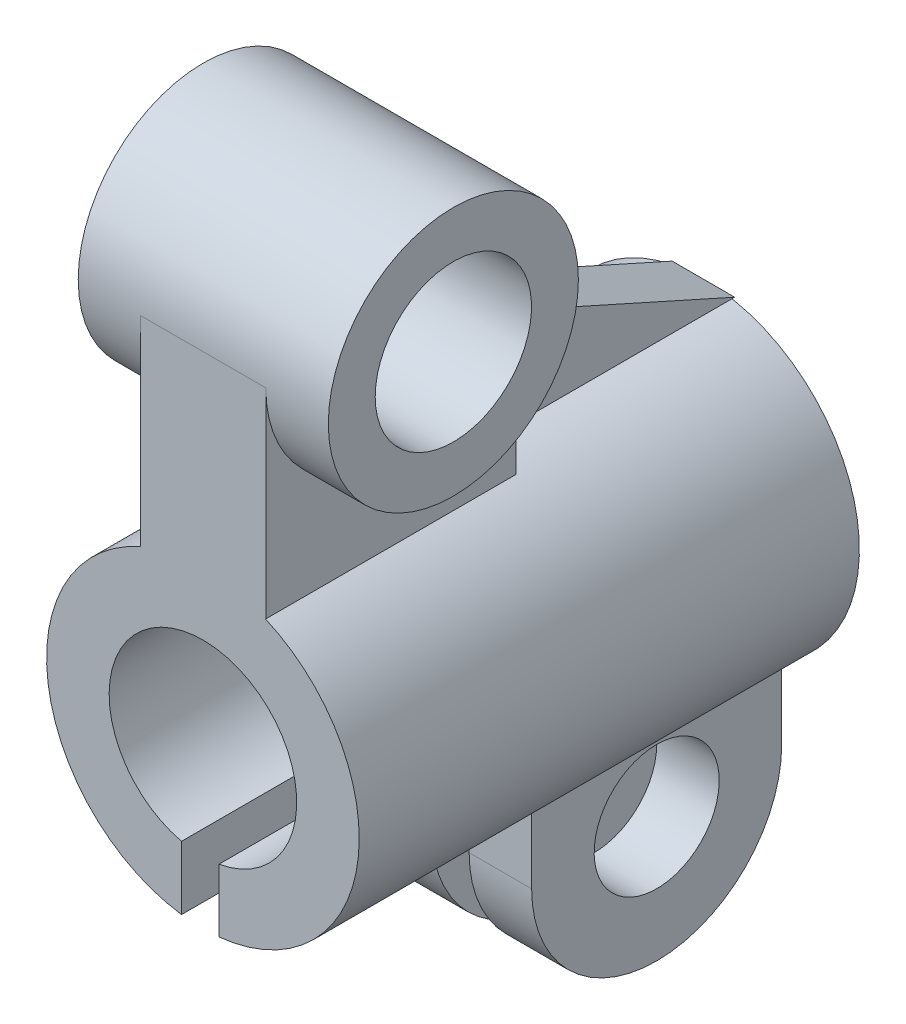
ISO-10303-21;
HEADER;
FILE_DESCRIPTION(('STEP AP214'),'2;1');
FILE_NAME('part.step','',(''),(''),'','','');
FILE_SCHEMA(('AUTOMOTIVE_DESIGN { 1 0 10303 214 1 1 1 1 }'));
ENDSEC;
DATA;
#1=APPLICATION_CONTEXT('core data for automotive mechanical design processes');
#2=APPLICATION_PROTOCOL_DEFINITION('international standard','automotive_design',2000,#1);
#3=PRODUCT_CONTEXT('',#1,'mechanical');
#4=PRODUCT('Part','Part','',(#3));
#5=PRODUCT_RELATED_PRODUCT_CATEGORY('part','',(#4));
#6=PRODUCT_DEFINITION_FORMATION('','',#4);
#7=PRODUCT_DEFINITION_CONTEXT('part definition',#1,'design');
#8=PRODUCT_DEFINITION('design','',#6,#7);
#9=PRODUCT_DEFINITION_SHAPE('','',#8);
#10=(LENGTH_UNIT() NAMED_UNIT(*) SI_UNIT(.MILLI.,.METRE.));
#11=(NAMED_UNIT(*) PLANE_ANGLE_UNIT() SI_UNIT($,.RADIAN.));
#12=(NAMED_UNIT(*) SI_UNIT($,.STERADIAN.) SOLID_ANGLE_UNIT());
#13=UNCERTAINTY_MEASURE_WITH_UNIT(LENGTH_MEASURE(1.E-05),#10,'distance_accuracy_value','');
#14=(GEOMETRIC_REPRESENTATION_CONTEXT(3) GLOBAL_UNCERTAINTY_ASSIGNED_CONTEXT((#13)) GLOBAL_UNIT_ASSIGNED_CONTEXT((#10,
#11,#12)) REPRESENTATION_CONTEXT('',''));
#15=CARTESIAN_POINT('',(0.,0.,0.));
#16=DIRECTION('',(0.,0.,1.));
#17=DIRECTION('',(1.,0.,0.));
#18=AXIS2_PLACEMENT_3D('',#15,#16,#17);
#19=CARTESIAN_POINT('',(-27.7278499890445,20.6508963836453,80.));
#20=DIRECTION('',(0.,0.,-1.));
#21=DIRECTION('',(-1.,0.,0.));
#22=AXIS2_PLACEMENT_3D('',#19,#20,#21);
#23=CYLINDRICAL_SURFACE('',#22,25.);
#24=CARTESIAN_POINT('',(-27.7278499890445,20.6508963836453,88261.9752119037));
#25=DIRECTION('',(0.,0.999999959885377,0.000283247671912091));
#26=DIRECTION('',(0.,0.000283247671912091,-0.999999959885377));
#27=AXIS2_PLACEMENT_3D('',#24,#25,#26);
#28=ELLIPSE('',#27,88261.9787524997,25.);
#29=CARTESIAN_POINT('',(-27.7278499890445,45.6508963836453,0.));
#30=VERTEX_POINT('',#29);
#31=CARTESIAN_POINT('',(-28.4804235733198,45.6395664763143,40.));
#32=VERTEX_POINT('',#31);
#33=EDGE_CURVE('E216',#30,#32,#28,.T.);
#34=ORIENTED_EDGE('',*,*,#33,.F.);
#35=CARTESIAN_POINT('',(-27.7278499890445,20.6508963836453,0.));
#36=DIRECTION('',(0.,0.,1.));
#37=DIRECTION('',(1.,0.,0.));
#38=AXIS2_PLACEMENT_3D('',#35,#36,#37);
#39=CIRCLE('',#38,25.);
#40=CARTESIAN_POINT('',(-41.0015400751516,-0.534219889294647,0.));
#41=VERTEX_POINT('',#40);
#42=EDGE_CURVE('E279',#30,#41,#39,.T.);
#43=ORIENTED_EDGE('',*,*,#42,.T.);
#44=DIRECTION('',(0.,0.,-1.));
#45=VECTOR('',#44,1.);
#46=CARTESIAN_POINT('',(-41.0015400751516,-0.534219889294654,80.));
#47=LINE('',#46,#45);
#48=CARTESIAN_POINT('',(-41.0015400751516,-0.534219889294647,40.));
#49=VERTEX_POINT('',#48);
#50=EDGE_CURVE('E293',#49,#41,#47,.T.);
#51=ORIENTED_EDGE('',*,*,#50,.F.);
#52=CARTESIAN_POINT('',(-27.7278499890445,20.6508963836453,40.));
#53=DIRECTION('',(0.,0.,1.));
#54=DIRECTION('',(1.,0.,0.));
#55=AXIS2_PLACEMENT_3D('',#52,#53,#54);
#56=CIRCLE('',#55,25.);
#57=CARTESIAN_POINT('',(-31.149550202957,-4.11383595179724,40.));
#58=VERTEX_POINT('',#57);
#59=EDGE_CURVE('E290',#49,#58,#56,.T.);
#60=ORIENTED_EDGE('',*,*,#59,.T.);
#61=DIRECTION('',(0.,0.,-1.));
#62=VECTOR('',#61,1.);
#63=CARTESIAN_POINT('',(-31.149550202957,-4.11383595179724,80.));
#64=LINE('',#63,#62);
#65=CARTESIAN_POINT('',(-31.149550202957,-4.11383595179724,80.));
#66=VERTEX_POINT('',#65);
#67=EDGE_CURVE('E240',#58,#66,#64,.F.);
#68=ORIENTED_EDGE('',*,*,#67,.T.);
#69=CARTESIAN_POINT('',(-27.7278499890445,20.6508963836453,80.));
#70=DIRECTION('',(0.,0.,1.));
#71=DIRECTION('',(1.,0.,0.));
#72=AXIS2_PLACEMENT_3D('',#69,#70,#71);
#73=CIRCLE('',#72,25.);
#74=CARTESIAN_POINT('',(-37.6730946822229,43.5875942277728,80.));
#75=VERTEX_POINT('',#74);
#76=EDGE_CURVE('E286',#75,#66,#73,.T.);
#77=ORIENTED_EDGE('',*,*,#76,.F.);
#78=DIRECTION('',(0.,0.,1.));
#79=VECTOR('',#78,1.);
#80=CARTESIAN_POINT('',(-37.6730946822229,43.5875942277728,40.));
#81=LINE('',#80,#79);
#82=CARTESIAN_POINT('',(-37.6730946822229,43.5875942277728,40.));
#83=VERTEX_POINT('',#82);
#84=EDGE_CURVE('E209',#83,#75,#81,.T.);
#85=ORIENTED_EDGE('',*,*,#84,.F.);
#86=CARTESIAN_POINT('',(-27.7278499890445,20.6508963836453,40.));
#87=DIRECTION('',(0.,0.,-1.));
#88=DIRECTION('',(-1.,0.,0.));
#89=AXIS2_PLACEMENT_3D('',#86,#87,#88);
#90=CIRCLE('',#89,25.);
#91=EDGE_CURVE('E319',#83,#32,#90,.T.);
#92=ORIENTED_EDGE('',*,*,#91,.T.);
#93=EDGE_LOOP('',(#34,#43,#51,#60,#68,#77,#85,#92));
#94=FACE_BOUND('',#93,.T.);
#95=ADVANCED_FACE('F43',(#94),#23,.T.);
#96=CARTESIAN_POINT('',(-26.9752764047693,45.6395664763143,40.));
#97=VERTEX_POINT('',#96);
#98=EDGE_CURVE('E333',#97,#30,#28,.T.);
#99=ORIENTED_EDGE('',*,*,#98,.F.);
#100=CARTESIAN_POINT('',(-17.7826052958661,43.5875942277728,40.));
#101=VERTEX_POINT('',#100);
#102=EDGE_CURVE('E316',#97,#101,#90,.T.);
#103=ORIENTED_EDGE('',*,*,#102,.T.);
#104=DIRECTION('',(0.,0.,-1.));
#105=VECTOR('',#104,1.);
#106=CARTESIAN_POINT('',(-17.7826052958661,43.5875942277728,80.));
#107=LINE('',#106,#105);
#108=CARTESIAN_POINT('',(-17.7826052958661,43.5875942277728,80.));
#109=VERTEX_POINT('',#108);
#110=EDGE_CURVE('E322',#101,#109,#107,.F.);
#111=ORIENTED_EDGE('',*,*,#110,.T.);
#112=CARTESIAN_POINT('',(-25.149550202957,-4.21579560007185,80.));
#113=VERTEX_POINT('',#112);
#114=EDGE_CURVE('E282',#113,#109,#73,.T.);
#115=ORIENTED_EDGE('',*,*,#114,.F.);
#116=DIRECTION('',(0.,0.,-1.));
#117=VECTOR('',#116,1.);
#118=CARTESIAN_POINT('',(-25.149550202957,-4.21579560007185,80.));
#119=LINE('',#118,#117);
#120=CARTESIAN_POINT('',(-25.149550202957,-4.21579560007185,40.));
#121=VERTEX_POINT('',#120);
#122=EDGE_CURVE('E249',#113,#121,#119,.T.);
#123=ORIENTED_EDGE('',*,*,#122,.T.);
#124=CARTESIAN_POINT('',(-15.149550202957,-0.95434313114166,40.));
#125=VERTEX_POINT('',#124);
#126=EDGE_CURVE('E285',#121,#125,#56,.T.);
#127=ORIENTED_EDGE('',*,*,#126,.T.);
#128=DIRECTION('',(0.,0.,-1.));
#129=VECTOR('',#128,1.);
#130=CARTESIAN_POINT('',(-15.149550202957,-0.95434313114166,80.));
#131=LINE('',#130,#129);
#132=CARTESIAN_POINT('',(-15.149550202957,-0.95434313114166,0.));
#133=VERTEX_POINT('',#132);
#134=EDGE_CURVE('E296',#125,#133,#131,.T.);
#135=ORIENTED_EDGE('',*,*,#134,.T.);
#136=EDGE_CURVE('E287',#133,#30,#39,.T.);
#137=ORIENTED_EDGE('',*,*,#136,.T.);
#138=EDGE_LOOP('',(#99,#103,#111,#115,#123,#127,#135,#137));
#139=FACE_BOUND('',#138,.T.);
#140=ADVANCED_FACE('F337',(#139),#23,.T.);
#141=CARTESIAN_POINT('',(0.,0.,40.));
#142=DIRECTION('',(0.,0.,-1.));
#143=DIRECTION('',(-1.,0.,0.));
#144=AXIS2_PLACEMENT_3D('',#141,#142,#143);
#145=PLANE('',#144);
#146=DIRECTION('',(0.,1.,0.));
#147=VECTOR('',#146,1.);
#148=CARTESIAN_POINT('',(-32.6730946822229,63.5875942277729,40.));
#149=LINE('',#148,#147);
#150=CARTESIAN_POINT('',(-32.6730946822229,45.6395664763143,40.));
#151=VERTEX_POINT('',#150);
#152=CARTESIAN_POINT('',(-32.6730946822229,63.5875942277729,40.));
#153=VERTEX_POINT('',#152);
#154=EDGE_CURVE('E503',#151,#153,#149,.T.);
#155=ORIENTED_EDGE('',*,*,#154,.F.);
#156=DIRECTION('',(1.,0.,0.));
#157=VECTOR('',#156,1.);
#158=CARTESIAN_POINT('',(-32.6730946822229,45.6395664763143,40.));
#159=LINE('',#158,#157);
#160=EDGE_CURVE('E339',#151,#32,#159,.T.);
#161=ORIENTED_EDGE('',*,*,#160,.T.);
#162=ORIENTED_EDGE('',*,*,#91,.F.);
#163=DIRECTION('',(0.,-1.,0.));
#164=VECTOR('',#163,1.);
#165=CARTESIAN_POINT('',(-37.6730946822229,43.5875942277728,40.));
#166=LINE('',#165,#164);
#167=CARTESIAN_POINT('',(-37.6730946822229,75.5875942277729,40.));
#168=VERTEX_POINT('',#167);
#169=EDGE_CURVE('E208',#168,#83,#166,.T.);
#170=ORIENTED_EDGE('',*,*,#169,.F.);
#171=DIRECTION('',(-1.,0.,0.));
#172=VECTOR('',#171,1.);
#173=CARTESIAN_POINT('',(-37.6730946822229,75.5875942277729,40.));
#174=LINE('',#173,#172);
#175=CARTESIAN_POINT('',(-17.6730946822229,75.5875942277729,40.));
#176=VERTEX_POINT('',#175);
#177=EDGE_CURVE('E188',#176,#168,#174,.T.);
#178=ORIENTED_EDGE('',*,*,#177,.F.);
#179=DIRECTION('',(0.,1.,0.));
#180=VECTOR('',#179,1.);
#181=CARTESIAN_POINT('',(-17.6730946822229,43.5875942277728,40.));
#182=LINE('',#181,#180);
#183=CARTESIAN_POINT('',(-17.6730946822229,43.5875942277728,40.));
#184=VERTEX_POINT('',#183);
#185=EDGE_CURVE('E196',#184,#176,#182,.T.);
#186=ORIENTED_EDGE('',*,*,#185,.F.);
#187=DIRECTION('',(1.,0.,0.));
#188=VECTOR('',#187,1.);
#189=CARTESIAN_POINT('',(-37.6730946822229,43.5875942277728,40.));
#190=LINE('',#189,#188);
#191=EDGE_CURVE('E202',#101,#184,#190,.T.);
#192=ORIENTED_EDGE('',*,*,#191,.F.);
#193=ORIENTED_EDGE('',*,*,#102,.F.);
#194=DIRECTION('',(1.,0.,0.));
#195=VECTOR('',#194,1.);
#196=CARTESIAN_POINT('',(0.,45.6395664763143,40.));
#197=LINE('',#196,#195);
#198=CARTESIAN_POINT('',(-22.6730946822229,45.6395664763143,40.));
#199=VERTEX_POINT('',#198);
#200=EDGE_CURVE('E52',#97,#199,#197,.T.);
#201=ORIENTED_EDGE('',*,*,#200,.T.);
#202=DIRECTION('',(0.,1.,0.));
#203=VECTOR('',#202,1.);
#204=CARTESIAN_POINT('',(-22.6730946822229,63.5875942277729,40.));
#205=LINE('',#204,#203);
#206=CARTESIAN_POINT('',(-22.6730946822229,63.5875942277729,40.));
#207=VERTEX_POINT('',#206);
#208=EDGE_CURVE('E328',#199,#207,#205,.T.);
#209=ORIENTED_EDGE('',*,*,#208,.T.);
#210=DIRECTION('',(1.,0.,0.));
#211=VECTOR('',#210,1.);
#212=CARTESIAN_POINT('',(-32.6730946822229,63.5875942277729,40.));
#213=LINE('',#212,#211);
#214=EDGE_CURVE('E342',#153,#207,#213,.T.);
#215=ORIENTED_EDGE('',*,*,#214,.F.);
#216=EDGE_LOOP('',(#155,#161,#162,#170,#178,#186,#192,#193,#201,#209,#215));
#217=FACE_BOUND('',#216,.T.);
#218=ADVANCED_FACE('F206',(#217),#145,.T.);
#219=CARTESIAN_POINT('',(-15.149550202957,-12.5342198892947,20.));
#220=DIRECTION('',(-1.,0.,0.));
#221=DIRECTION('',(0.,0.,1.));
#222=AXIS2_PLACEMENT_3D('',#219,#220,#221);
#223=CYLINDRICAL_SURFACE('',#222,20.);
#224=CARTESIAN_POINT('',(-25.149550202957,-12.5342198892947,20.));
#225=DIRECTION('',(1.,0.,0.));
#226=DIRECTION('',(0.,0.,-1.));
#227=AXIS2_PLACEMENT_3D('',#224,#225,#226);
#228=CIRCLE('',#227,20.);
#229=CARTESIAN_POINT('',(-25.149550202957,-12.5342198892947,0.));
#230=VERTEX_POINT('',#229);
#231=CARTESIAN_POINT('',(-25.149550202957,-12.5342198892947,40.));
#232=VERTEX_POINT('',#231);
#233=EDGE_CURVE('E252',#230,#232,#228,.F.);
#234=ORIENTED_EDGE('',*,*,#233,.F.);
#235=DIRECTION('',(1.,0.,0.));
#236=VECTOR('',#235,1.);
#237=CARTESIAN_POINT('',(-15.149550202957,-12.5342198892947,0.));
#238=LINE('',#237,#236);
#239=CARTESIAN_POINT('',(-15.149550202957,-12.5342198892947,0.));
#240=VERTEX_POINT('',#239);
#241=EDGE_CURVE('E300',#240,#230,#238,.F.);
#242=ORIENTED_EDGE('',*,*,#241,.F.);
#243=CARTESIAN_POINT('',(-15.149550202957,-12.5342198892947,20.));
#244=DIRECTION('',(1.,0.,0.));
#245=DIRECTION('',(0.,1.,0.));
#246=AXIS2_PLACEMENT_3D('',#243,#244,#245);
#247=CIRCLE('',#246,20.);
#248=CARTESIAN_POINT('',(-15.149550202957,-12.5342198892947,40.));
#249=VERTEX_POINT('',#248);
#250=EDGE_CURVE('E307',#249,#240,#247,.T.);
#251=ORIENTED_EDGE('',*,*,#250,.F.);
#252=DIRECTION('',(-1.,0.,0.));
#253=VECTOR('',#252,1.);
#254=CARTESIAN_POINT('',(0.,-12.5342198892947,40.));
#255=LINE('',#254,#253);
#256=EDGE_CURVE('E303',#232,#249,#255,.F.);
#257=ORIENTED_EDGE('',*,*,#256,.F.);
#258=EDGE_LOOP('',(#234,#242,#251,#257));
#259=FACE_BOUND('',#258,.T.);
#260=ADVANCED_FACE('F368',(#259),#223,.T.);
#261=CARTESIAN_POINT('',(0.,0.,40.));
#262=DIRECTION('',(0.,0.,1.));
#263=DIRECTION('',(1.,0.,0.));
#264=AXIS2_PLACEMENT_3D('',#261,#262,#263);
#265=PLANE('',#264);
#266=DIRECTION('',(0.,1.,0.));
#267=VECTOR('',#266,1.);
#268=CARTESIAN_POINT('',(-25.149550202957,0.,40.));
#269=LINE('',#268,#267);
#270=EDGE_CURVE('E314',#232,#121,#269,.T.);
#271=ORIENTED_EDGE('',*,*,#270,.F.);
#272=ORIENTED_EDGE('',*,*,#256,.T.);
#273=DIRECTION('',(0.,-1.,0.));
#274=VECTOR('',#273,1.);
#275=CARTESIAN_POINT('',(-15.149550202957,-0.534219889294654,40.));
#276=LINE('',#275,#274);
#277=EDGE_CURVE('E263',#125,#249,#276,.T.);
#278=ORIENTED_EDGE('',*,*,#277,.F.);
#279=ORIENTED_EDGE('',*,*,#126,.F.);
#280=EDGE_LOOP('',(#271,#272,#278,#279));
#281=FACE_BOUND('',#280,.T.);
#282=ADVANCED_FACE('F372',(#281),#265,.T.);
#283=CARTESIAN_POINT('',(-31.149550202957,-12.5342198892947,20.));
#284=DIRECTION('',(-1.,0.,0.));
#285=DIRECTION('',(0.,0.,1.));
#286=AXIS2_PLACEMENT_3D('',#283,#284,#285);
#287=CIRCLE('',#286,20.);
#288=CARTESIAN_POINT('',(-31.149550202957,-12.5342198892947,40.));
#289=VERTEX_POINT('',#288);
#290=CARTESIAN_POINT('',(-31.149550202957,-12.5342198892947,0.));
#291=VERTEX_POINT('',#290);
#292=EDGE_CURVE('E245',#289,#291,#287,.F.);
#293=ORIENTED_EDGE('',*,*,#292,.F.);
#294=CARTESIAN_POINT('',(-41.149550202957,-12.5342198892947,40.));
#295=VERTEX_POINT('',#294);
#296=EDGE_CURVE('E304',#295,#289,#255,.F.);
#297=ORIENTED_EDGE('',*,*,#296,.F.);
#298=CARTESIAN_POINT('',(-41.149550202957,-12.5342198892947,20.));
#299=DIRECTION('',(1.,0.,0.));
#300=DIRECTION('',(0.,0.,-1.));
#301=AXIS2_PLACEMENT_3D('',#298,#299,#300);
#302=CIRCLE('',#301,20.);
#303=CARTESIAN_POINT('',(-41.149550202957,-12.5342198892947,0.));
#304=VERTEX_POINT('',#303);
#305=EDGE_CURVE('E309',#304,#295,#302,.F.);
#306=ORIENTED_EDGE('',*,*,#305,.F.);
#307=EDGE_CURVE('E299',#291,#304,#238,.F.);
#308=ORIENTED_EDGE('',*,*,#307,.F.);
#309=EDGE_LOOP('',(#293,#297,#306,#308));
#310=FACE_BOUND('',#309,.T.);
#311=ADVANCED_FACE('F46',(#310),#223,.T.);
#312=CARTESIAN_POINT('',(-27.7278499890445,20.6508963836453,80.));
#313=DIRECTION('',(0.,0.,1.));
#314=DIRECTION('',(1.,0.,0.));
#315=AXIS2_PLACEMENT_3D('',#312,#313,#314);
#316=PLANE('',#315);
#317=ORIENTED_EDGE('',*,*,#114,.T.);
#318=DIRECTION('',(1.,0.,0.));
#319=VECTOR('',#318,1.);
#320=CARTESIAN_POINT('',(-37.6730946822229,43.5875942277728,80.));
#321=LINE('',#320,#319);
#322=CARTESIAN_POINT('',(-17.6730946822229,43.5875942277728,80.));
#323=VERTEX_POINT('',#322);
#324=EDGE_CURVE('E215',#109,#323,#321,.T.);
#325=ORIENTED_EDGE('',*,*,#324,.T.);
#326=DIRECTION('',(0.,1.,0.));
#327=VECTOR('',#326,1.);
#328=CARTESIAN_POINT('',(-17.6730946822229,43.5875942277728,80.));
#329=LINE('',#328,#327);
#330=CARTESIAN_POINT('',(-17.6730946822229,75.5875942277729,80.));
#331=VERTEX_POINT('',#330);
#332=EDGE_CURVE('E218',#323,#331,#329,.T.);
#333=ORIENTED_EDGE('',*,*,#332,.T.);
#334=DIRECTION('',(-1.,0.,0.));
#335=VECTOR('',#334,1.);
#336=CARTESIAN_POINT('',(-37.6730946822229,75.5875942277729,80.));
#337=LINE('',#336,#335);
#338=CARTESIAN_POINT('',(-37.6730946822229,75.5875942277729,80.));
#339=VERTEX_POINT('',#338);
#340=EDGE_CURVE('E190',#331,#339,#337,.T.);
#341=ORIENTED_EDGE('',*,*,#340,.T.);
#342=DIRECTION('',(0.,-1.,0.));
#343=VECTOR('',#342,1.);
#344=CARTESIAN_POINT('',(-37.6730946822229,43.5875942277728,80.));
#345=LINE('',#344,#343);
#346=EDGE_CURVE('E67',#339,#75,#345,.T.);
#347=ORIENTED_EDGE('',*,*,#346,.T.);
#348=ORIENTED_EDGE('',*,*,#76,.T.);
#349=DIRECTION('',(0.,1.,0.));
#350=VECTOR('',#349,1.);
#351=CARTESIAN_POINT('',(-31.149550202957,-32.5342198892947,80.));
#352=LINE('',#351,#350);
#353=CARTESIAN_POINT('',(-31.149550202957,6.04637764299135,80.));
#354=VERTEX_POINT('',#353);
#355=EDGE_CURVE('E236',#66,#354,#352,.T.);
#356=ORIENTED_EDGE('',*,*,#355,.T.);
#357=CARTESIAN_POINT('',(-27.7278499890445,20.6508963836453,80.));
#358=DIRECTION('',(0.,0.,1.));
#359=DIRECTION('',(1.,0.,0.));
#360=AXIS2_PLACEMENT_3D('',#357,#358,#359);
#361=CIRCLE('',#360,15.);
#362=CARTESIAN_POINT('',(-25.149550202957,5.87414538036105,80.));
#363=VERTEX_POINT('',#362);
#364=EDGE_CURVE('E276',#363,#354,#361,.T.);
#365=ORIENTED_EDGE('',*,*,#364,.F.);
#366=DIRECTION('',(0.,-1.,0.));
#367=VECTOR('',#366,1.);
#368=CARTESIAN_POINT('',(-25.149550202957,-32.5342198892947,80.));
#369=LINE('',#368,#367);
#370=EDGE_CURVE('E233',#363,#113,#369,.T.);
#371=ORIENTED_EDGE('',*,*,#370,.T.);
#372=EDGE_LOOP('',(#317,#325,#333,#341,#347,#348,#356,#365,#371));
#373=FACE_BOUND('',#372,.T.);
#374=ADVANCED_FACE('F349',(#373),#316,.T.);
#375=CARTESIAN_POINT('',(-27.7278499890445,20.6508963836453,0.));
#376=DIRECTION('',(0.,0.,1.));
#377=DIRECTION('',(1.,0.,0.));
#378=AXIS2_PLACEMENT_3D('',#375,#376,#377);
#379=PLANE('',#378);
#380=ORIENTED_EDGE('',*,*,#241,.T.);
#381=DIRECTION('',(0.,-1.,0.));
#382=VECTOR('',#381,1.);
#383=CARTESIAN_POINT('',(-25.149550202957,-32.5342198892947,0.));
#384=LINE('',#383,#382);
#385=CARTESIAN_POINT('',(-25.149550202957,5.87414538036105,0.));
#386=VERTEX_POINT('',#385);
#387=EDGE_CURVE('E232',#386,#230,#384,.T.);
#388=ORIENTED_EDGE('',*,*,#387,.F.);
#389=CARTESIAN_POINT('',(-27.7278499890445,20.6508963836453,0.));
#390=DIRECTION('',(0.,0.,1.));
#391=DIRECTION('',(1.,0.,0.));
#392=AXIS2_PLACEMENT_3D('',#389,#390,#391);
#393=CIRCLE('',#392,15.);
#394=CARTESIAN_POINT('',(-31.149550202957,6.04637764299135,0.));
#395=VERTEX_POINT('',#394);
#396=EDGE_CURVE('E275',#386,#395,#393,.T.);
#397=ORIENTED_EDGE('',*,*,#396,.T.);
#398=DIRECTION('',(0.,1.,0.));
#399=VECTOR('',#398,1.);
#400=CARTESIAN_POINT('',(-31.149550202957,-32.5342198892947,0.));
#401=LINE('',#400,#399);
#402=EDGE_CURVE('E237',#291,#395,#401,.T.);
#403=ORIENTED_EDGE('',*,*,#402,.F.);
#404=ORIENTED_EDGE('',*,*,#307,.T.);
#405=DIRECTION('',(0.,-1.,0.));
#406=VECTOR('',#405,1.);
#407=CARTESIAN_POINT('',(-41.149550202957,-0.534219889294654,0.));
#408=LINE('',#407,#406);
#409=CARTESIAN_POINT('',(-41.149550202957,-0.534219889294654,0.));
#410=VERTEX_POINT('',#409);
#411=EDGE_CURVE('E256',#410,#304,#408,.T.);
#412=ORIENTED_EDGE('',*,*,#411,.F.);
#413=DIRECTION('',(-1.,0.,0.));
#414=VECTOR('',#413,1.);
#415=CARTESIAN_POINT('',(-15.149550202957,-0.534219889294654,0.));
#416=LINE('',#415,#414);
#417=EDGE_CURVE('E269',#41,#410,#416,.T.);
#418=ORIENTED_EDGE('',*,*,#417,.F.);
#419=ORIENTED_EDGE('',*,*,#42,.F.);
#420=ORIENTED_EDGE('',*,*,#136,.F.);
#421=DIRECTION('',(0.,-1.,0.));
#422=VECTOR('',#421,1.);
#423=CARTESIAN_POINT('',(-15.149550202957,-0.534219889294654,0.));
#424=LINE('',#423,#422);
#425=EDGE_CURVE('E261',#133,#240,#424,.T.);
#426=ORIENTED_EDGE('',*,*,#425,.T.);
#427=EDGE_LOOP('',(#380,#388,#397,#403,#404,#412,#418,#419,#420,#426));
#428=FACE_BOUND('',#427,.T.);
#429=ADVANCED_FACE('F361',(#428),#379,.F.);
#430=CARTESIAN_POINT('',(-27.7278499890445,20.6508963836453,80.));
#431=DIRECTION('',(0.,0.,-1.));
#432=DIRECTION('',(-1.,0.,0.));
#433=AXIS2_PLACEMENT_3D('',#430,#431,#432);
#434=CYLINDRICAL_SURFACE('',#433,15.);
#435=DIRECTION('',(0.,0.,-1.));
#436=VECTOR('',#435,1.);
#437=CARTESIAN_POINT('',(-25.149550202957,5.87414538036105,80.));
#438=LINE('',#437,#436);
#439=EDGE_CURVE('E254',#363,#386,#438,.T.);
#440=ORIENTED_EDGE('',*,*,#439,.F.);
#441=ORIENTED_EDGE('',*,*,#364,.T.);
#442=DIRECTION('',(0.,0.,-1.));
#443=VECTOR('',#442,1.);
#444=CARTESIAN_POINT('',(-31.149550202957,6.04637764299135,80.));
#445=LINE('',#444,#443);
#446=EDGE_CURVE('E247',#395,#354,#445,.F.);
#447=ORIENTED_EDGE('',*,*,#446,.F.);
#448=ORIENTED_EDGE('',*,*,#396,.F.);
#449=EDGE_LOOP('',(#440,#441,#447,#448));
#450=FACE_BOUND('',#449,.T.);
#451=ADVANCED_FACE('F357',(#450),#434,.F.);
#452=CARTESIAN_POINT('',(-15.149550202957,-0.534219889294654,40.));
#453=DIRECTION('',(1.,0.,0.));
#454=DIRECTION('',(0.,1.,0.));
#455=AXIS2_PLACEMENT_3D('',#452,#453,#454);
#456=PLANE('',#455);
#457=CARTESIAN_POINT('',(-15.149550202957,-12.5342198892947,20.));
#458=DIRECTION('',(1.,0.,0.));
#459=DIRECTION('',(0.,1.,0.));
#460=AXIS2_PLACEMENT_3D('',#457,#458,#459);
#461=CIRCLE('',#460,10.);
#462=CARTESIAN_POINT('',(-15.149550202957,-2.53421988929465,20.));
#463=VERTEX_POINT('',#462);
#464=EDGE_CURVE('E229',#463,#463,#461,.T.);
#465=ORIENTED_EDGE('',*,*,#464,.F.);
#466=EDGE_LOOP('',(#465));
#467=FACE_BOUND('',#466,.T.);
#468=ORIENTED_EDGE('',*,*,#277,.T.);
#469=ORIENTED_EDGE('',*,*,#250,.T.);
#470=ORIENTED_EDGE('',*,*,#425,.F.);
#471=ORIENTED_EDGE('',*,*,#134,.F.);
#472=EDGE_LOOP('',(#468,#469,#470,#471));
#473=FACE_BOUND('',#472,.T.);
#474=ADVANCED_FACE('F377',(#467,#473),#456,.T.);
#475=CARTESIAN_POINT('',(-15.149550202957,-0.534219889294654,40.));
#476=DIRECTION('',(0.,-1.,0.));
#477=DIRECTION('',(0.,0.,-1.));
#478=AXIS2_PLACEMENT_3D('',#475,#476,#477);
#479=PLANE('',#478);
#480=DIRECTION('',(-1.,0.,0.));
#481=VECTOR('',#480,1.);
#482=CARTESIAN_POINT('',(-15.149550202957,-0.534219889294654,40.));
#483=LINE('',#482,#481);
#484=CARTESIAN_POINT('',(-41.149550202957,-0.534219889294654,40.));
#485=VERTEX_POINT('',#484);
#486=EDGE_CURVE('E260',#49,#485,#483,.T.);
#487=ORIENTED_EDGE('',*,*,#486,.F.);
#488=ORIENTED_EDGE('',*,*,#50,.T.);
#489=ORIENTED_EDGE('',*,*,#417,.T.);
#490=DIRECTION('',(0.,0.,-1.));
#491=VECTOR('',#490,1.);
#492=CARTESIAN_POINT('',(-41.149550202957,-0.534219889294654,40.));
#493=LINE('',#492,#491);
#494=EDGE_CURVE('E266',#485,#410,#493,.T.);
#495=ORIENTED_EDGE('',*,*,#494,.F.);
#496=EDGE_LOOP('',(#487,#488,#489,#495));
#497=FACE_BOUND('',#496,.T.);
#498=ADVANCED_FACE('F386',(#497),#479,.F.);
#499=CARTESIAN_POINT('',(-41.149550202957,-0.534219889294654,40.));
#500=DIRECTION('',(1.,0.,0.));
#501=DIRECTION('',(0.,0.,-1.));
#502=AXIS2_PLACEMENT_3D('',#499,#500,#501);
#503=PLANE('',#502);
#504=CARTESIAN_POINT('',(-41.149550202957,-12.5342198892947,20.));
#505=DIRECTION('',(1.,0.,0.));
#506=DIRECTION('',(0.,0.,-1.));
#507=AXIS2_PLACEMENT_3D('',#504,#505,#506);
#508=CIRCLE('',#507,10.);
#509=CARTESIAN_POINT('',(-41.149550202957,-12.5342198892947,10.));
#510=VERTEX_POINT('',#509);
#511=EDGE_CURVE('E226',#510,#510,#508,.T.);
#512=ORIENTED_EDGE('',*,*,#511,.T.);
#513=EDGE_LOOP('',(#512));
#514=FACE_BOUND('',#513,.T.);
#515=ORIENTED_EDGE('',*,*,#411,.T.);
#516=ORIENTED_EDGE('',*,*,#305,.T.);
#517=DIRECTION('',(0.,-1.,0.));
#518=VECTOR('',#517,1.);
#519=CARTESIAN_POINT('',(-41.149550202957,-0.534219889294654,40.));
#520=LINE('',#519,#518);
#521=EDGE_CURVE('E257',#485,#295,#520,.T.);
#522=ORIENTED_EDGE('',*,*,#521,.F.);
#523=ORIENTED_EDGE('',*,*,#494,.T.);
#524=EDGE_LOOP('',(#515,#516,#522,#523));
#525=FACE_BOUND('',#524,.T.);
#526=ADVANCED_FACE('F401',(#514,#525),#503,.F.);
#527=DIRECTION('',(0.,-1.,0.));
#528=VECTOR('',#527,1.);
#529=CARTESIAN_POINT('',(-31.149550202957,0.,40.));
#530=LINE('',#529,#528);
#531=EDGE_CURVE('E311',#58,#289,#530,.T.);
#532=ORIENTED_EDGE('',*,*,#531,.F.);
#533=ORIENTED_EDGE('',*,*,#59,.F.);
#534=ORIENTED_EDGE('',*,*,#486,.T.);
#535=ORIENTED_EDGE('',*,*,#521,.T.);
#536=ORIENTED_EDGE('',*,*,#296,.T.);
#537=EDGE_LOOP('',(#532,#533,#534,#535,#536));
#538=FACE_BOUND('',#537,.T.);
#539=ADVANCED_FACE('F391',(#538),#265,.T.);
#540=CARTESIAN_POINT('',(-31.149550202957,-32.5342198892947,80.));
#541=DIRECTION('',(-1.,0.,0.));
#542=DIRECTION('',(0.,0.,1.));
#543=AXIS2_PLACEMENT_3D('',#540,#541,#542);
#544=PLANE('',#543);
#545=CARTESIAN_POINT('',(-31.149550202957,-12.5342198892947,20.));
#546=DIRECTION('',(-1.,0.,0.));
#547=DIRECTION('',(0.,0.,1.));
#548=AXIS2_PLACEMENT_3D('',#545,#546,#547);
#549=CIRCLE('',#548,10.);
#550=CARTESIAN_POINT('',(-31.149550202957,-12.5342198892947,30.));
#551=VERTEX_POINT('',#550);
#552=EDGE_CURVE('E223',#551,#551,#549,.T.);
#553=ORIENTED_EDGE('',*,*,#552,.T.);
#554=EDGE_LOOP('',(#553));
#555=FACE_BOUND('',#554,.T.);
#556=ORIENTED_EDGE('',*,*,#446,.T.);
#557=ORIENTED_EDGE('',*,*,#355,.F.);
#558=ORIENTED_EDGE('',*,*,#67,.F.);
#559=ORIENTED_EDGE('',*,*,#531,.T.);
#560=ORIENTED_EDGE('',*,*,#292,.T.);
#561=ORIENTED_EDGE('',*,*,#402,.T.);
#562=EDGE_LOOP('',(#556,#557,#558,#559,#560,#561));
#563=FACE_BOUND('',#562,.T.);
#564=ADVANCED_FACE('F396',(#555,#563),#544,.F.);
#565=CARTESIAN_POINT('',(-25.149550202957,-32.5342198892947,80.));
#566=DIRECTION('',(1.,0.,0.));
#567=DIRECTION('',(0.,0.,-1.));
#568=AXIS2_PLACEMENT_3D('',#565,#566,#567);
#569=PLANE('',#568);
#570=CARTESIAN_POINT('',(-25.149550202957,-12.5342198892947,20.));
#571=DIRECTION('',(1.,0.,0.));
#572=DIRECTION('',(0.,0.,-1.));
#573=AXIS2_PLACEMENT_3D('',#570,#571,#572);
#574=CIRCLE('',#573,10.);
#575=CARTESIAN_POINT('',(-25.149550202957,-12.5342198892947,10.));
#576=VERTEX_POINT('',#575);
#577=EDGE_CURVE('E221',#576,#576,#574,.T.);
#578=ORIENTED_EDGE('',*,*,#577,.T.);
#579=EDGE_LOOP('',(#578));
#580=FACE_BOUND('',#579,.T.);
#581=ORIENTED_EDGE('',*,*,#439,.T.);
#582=ORIENTED_EDGE('',*,*,#387,.T.);
#583=ORIENTED_EDGE('',*,*,#233,.T.);
#584=ORIENTED_EDGE('',*,*,#270,.T.);
#585=ORIENTED_EDGE('',*,*,#122,.F.);
#586=ORIENTED_EDGE('',*,*,#370,.F.);
#587=EDGE_LOOP('',(#581,#582,#583,#584,#585,#586));
#588=FACE_BOUND('',#587,.T.);
#589=ADVANCED_FACE('F353',(#580,#588),#569,.F.);
#590=CARTESIAN_POINT('',(-2.72784998904453,-12.5342198892947,20.));
#591=DIRECTION('',(-1.,0.,0.));
#592=DIRECTION('',(0.,0.,1.));
#593=AXIS2_PLACEMENT_3D('',#590,#591,#592);
#594=CYLINDRICAL_SURFACE('',#593,10.);
#595=ORIENTED_EDGE('',*,*,#464,.T.);
#596=EDGE_LOOP('',(#595));
#597=FACE_BOUND('',#596,.T.);
#598=ORIENTED_EDGE('',*,*,#577,.F.);
#599=EDGE_LOOP('',(#598));
#600=FACE_BOUND('',#599,.T.);
#601=ADVANCED_FACE('F435',(#597,#600),#594,.F.);
#602=ORIENTED_EDGE('',*,*,#552,.F.);
#603=EDGE_LOOP('',(#602));
#604=FACE_BOUND('',#603,.T.);
#605=ORIENTED_EDGE('',*,*,#511,.F.);
#606=EDGE_LOOP('',(#605));
#607=FACE_BOUND('',#606,.T.);
#608=ADVANCED_FACE('F439',(#604,#607),#594,.F.);
#609=CARTESIAN_POINT('',(-37.6730946822229,43.5875942277728,40.));
#610=DIRECTION('',(0.,-1.,0.));
#611=DIRECTION('',(0.,0.,-1.));
#612=AXIS2_PLACEMENT_3D('',#609,#610,#611);
#613=PLANE('',#612);
#614=ORIENTED_EDGE('',*,*,#110,.F.);
#615=ORIENTED_EDGE('',*,*,#191,.T.);
#616=DIRECTION('',(0.,0.,1.));
#617=VECTOR('',#616,1.);
#618=CARTESIAN_POINT('',(-17.6730946822229,43.5875942277728,40.));
#619=LINE('',#618,#617);
#620=EDGE_CURVE('E199',#184,#323,#619,.T.);
#621=ORIENTED_EDGE('',*,*,#620,.T.);
#622=ORIENTED_EDGE('',*,*,#324,.F.);
#623=EDGE_LOOP('',(#614,#615,#621,#622));
#624=FACE_BOUND('',#623,.T.);
#625=ADVANCED_FACE('F347',(#624),#613,.T.);
#626=CARTESIAN_POINT('',(-37.6730946822229,43.5875942277728,40.));
#627=DIRECTION('',(-1.,0.,0.));
#628=DIRECTION('',(0.,0.,1.));
#629=AXIS2_PLACEMENT_3D('',#626,#627,#628);
#630=PLANE('',#629);
#631=ORIENTED_EDGE('',*,*,#346,.F.);
#632=CARTESIAN_POINT('',(-37.6730946822229,75.5875942277729,60.));
#633=DIRECTION('',(-1.,0.,0.));
#634=DIRECTION('',(0.,0.,1.));
#635=AXIS2_PLACEMENT_3D('',#632,#633,#634);
#636=CIRCLE('',#635,20.);
#637=EDGE_CURVE('E497',#339,#168,#636,.F.);
#638=ORIENTED_EDGE('',*,*,#637,.T.);
#639=ORIENTED_EDGE('',*,*,#169,.T.);
#640=ORIENTED_EDGE('',*,*,#84,.T.);
#641=EDGE_LOOP('',(#631,#638,#639,#640));
#642=FACE_BOUND('',#641,.T.);
#643=ADVANCED_FACE('F443',(#642),#630,.T.);
#644=CARTESIAN_POINT('',(-17.6730946822229,43.5875942277728,40.));
#645=DIRECTION('',(1.,0.,0.));
#646=DIRECTION('',(0.,0.,-1.));
#647=AXIS2_PLACEMENT_3D('',#644,#645,#646);
#648=PLANE('',#647);
#649=ORIENTED_EDGE('',*,*,#185,.T.);
#650=CARTESIAN_POINT('',(-17.6730946822229,75.5875942277729,60.));
#651=DIRECTION('',(1.,0.,0.));
#652=DIRECTION('',(0.,0.,-1.));
#653=AXIS2_PLACEMENT_3D('',#650,#651,#652);
#654=CIRCLE('',#653,20.);
#655=EDGE_CURVE('E11',#176,#331,#654,.F.);
#656=ORIENTED_EDGE('',*,*,#655,.T.);
#657=ORIENTED_EDGE('',*,*,#332,.F.);
#658=ORIENTED_EDGE('',*,*,#620,.F.);
#659=EDGE_LOOP('',(#649,#656,#657,#658));
#660=FACE_BOUND('',#659,.T.);
#661=ADVANCED_FACE('F197',(#660),#648,.T.);
#662=CARTESIAN_POINT('',(-32.6730946822229,45.6395664763143,40.));
#663=DIRECTION('',(0.,0.999999959885377,0.000283247671912091));
#664=DIRECTION('',(0.,-0.000283247671912091,0.999999959885377));
#665=AXIS2_PLACEMENT_3D('',#662,#663,#664);
#666=PLANE('',#665);
#667=DIRECTION('',(1.,0.,0.));
#668=VECTOR('',#667,1.);
#669=CARTESIAN_POINT('',(-32.6730946822229,45.6508963836453,0.));
#670=LINE('',#669,#668);
#671=CARTESIAN_POINT('',(-32.6730946822229,45.6508963836453,0.));
#672=VERTEX_POINT('',#671);
#673=EDGE_CURVE('E511',#672,#30,#670,.T.);
#674=ORIENTED_EDGE('',*,*,#673,.T.);
#675=ORIENTED_EDGE('',*,*,#33,.T.);
#676=ORIENTED_EDGE('',*,*,#160,.F.);
#677=DIRECTION('',(0.,-0.000283247671912091,0.999999959885377));
#678=VECTOR('',#677,1.);
#679=CARTESIAN_POINT('',(-32.6730946822229,45.6395664763143,40.));
#680=LINE('',#679,#678);
#681=EDGE_CURVE('E501',#672,#151,#680,.T.);
#682=ORIENTED_EDGE('',*,*,#681,.F.);
#683=EDGE_LOOP('',(#674,#675,#676,#682));
#684=FACE_BOUND('',#683,.T.);
#685=ADVANCED_FACE('F450',(#684),#666,.F.);
#686=ORIENTED_EDGE('',*,*,#200,.F.);
#687=ORIENTED_EDGE('',*,*,#98,.T.);
#688=CARTESIAN_POINT('',(-22.6730946822229,45.6508963836453,0.));
#689=VERTEX_POINT('',#688);
#690=EDGE_CURVE('E507',#30,#689,#670,.T.);
#691=ORIENTED_EDGE('',*,*,#690,.T.);
#692=DIRECTION('',(0.,-0.000283247671912091,0.999999959885377));
#693=VECTOR('',#692,1.);
#694=CARTESIAN_POINT('',(-22.6730946822229,45.6395664763143,40.));
#695=LINE('',#694,#693);
#696=EDGE_CURVE('E335',#689,#199,#695,.T.);
#697=ORIENTED_EDGE('',*,*,#696,.T.);
#698=EDGE_LOOP('',(#686,#687,#691,#697));
#699=FACE_BOUND('',#698,.T.);
#700=ADVANCED_FACE('F332',(#699),#666,.F.);
#701=CARTESIAN_POINT('',(-32.6730946822229,45.6508963836453,0.));
#702=DIRECTION('',(0.,-0.912461095797017,0.409163474245817));
#703=DIRECTION('',(0.,-0.409163474245817,-0.912461095797017));
#704=AXIS2_PLACEMENT_3D('',#701,#702,#703);
#705=PLANE('',#704);
#706=DIRECTION('',(0.,-0.409163474245817,-0.912461095797017));
#707=VECTOR('',#706,1.);
#708=CARTESIAN_POINT('',(-22.6730946822229,45.6508963836453,0.));
#709=LINE('',#708,#707);
#710=EDGE_CURVE('E59',#207,#689,#709,.T.);
#711=ORIENTED_EDGE('',*,*,#710,.T.);
#712=ORIENTED_EDGE('',*,*,#690,.F.);
#713=ORIENTED_EDGE('',*,*,#673,.F.);
#714=DIRECTION('',(0.,-0.409163474245817,-0.912461095797017));
#715=VECTOR('',#714,1.);
#716=CARTESIAN_POINT('',(-32.6730946822229,45.6508963836453,0.));
#717=LINE('',#716,#715);
#718=EDGE_CURVE('E505',#153,#672,#717,.T.);
#719=ORIENTED_EDGE('',*,*,#718,.F.);
#720=ORIENTED_EDGE('',*,*,#214,.T.);
#721=EDGE_LOOP('',(#711,#712,#713,#719,#720));
#722=FACE_BOUND('',#721,.T.);
#723=ADVANCED_FACE('F456',(#722),#705,.F.);
#724=CARTESIAN_POINT('',(-32.6730946822229,0.,0.));
#725=DIRECTION('',(-1.,0.,0.));
#726=DIRECTION('',(0.,0.,1.));
#727=AXIS2_PLACEMENT_3D('',#724,#725,#726);
#728=PLANE('',#727);
#729=ORIENTED_EDGE('',*,*,#681,.T.);
#730=ORIENTED_EDGE('',*,*,#154,.T.);
#731=ORIENTED_EDGE('',*,*,#718,.T.);
#732=EDGE_LOOP('',(#729,#730,#731));
#733=FACE_BOUND('',#732,.T.);
#734=ADVANCED_FACE('F459',(#733),#728,.T.);
#735=CARTESIAN_POINT('',(-22.6730946822229,0.,0.));
#736=DIRECTION('',(-1.,0.,0.));
#737=DIRECTION('',(0.,0.,1.));
#738=AXIS2_PLACEMENT_3D('',#735,#736,#737);
#739=PLANE('',#738);
#740=ORIENTED_EDGE('',*,*,#696,.F.);
#741=ORIENTED_EDGE('',*,*,#710,.F.);
#742=ORIENTED_EDGE('',*,*,#208,.F.);
#743=EDGE_LOOP('',(#740,#741,#742));
#744=FACE_BOUND('',#743,.T.);
#745=ADVANCED_FACE('F461',(#744),#739,.F.);
#746=CARTESIAN_POINT('',(-47.6730946822229,75.5875942277729,60.));
#747=DIRECTION('',(-1.,0.,0.));
#748=DIRECTION('',(0.,0.,1.));
#749=AXIS2_PLACEMENT_3D('',#746,#747,#748);
#750=PLANE('',#749);
#751=CARTESIAN_POINT('',(-47.6730946822229,75.5875942277729,60.));
#752=DIRECTION('',(-1.,0.,0.));
#753=DIRECTION('',(0.,0.,1.));
#754=AXIS2_PLACEMENT_3D('',#751,#752,#753);
#755=CIRCLE('',#754,20.);
#756=CARTESIAN_POINT('',(-47.6730946822229,75.5875942277729,80.));
#757=VERTEX_POINT('',#756);
#758=EDGE_CURVE('E494',#757,#757,#755,.T.);
#759=ORIENTED_EDGE('',*,*,#758,.T.);
#760=EDGE_LOOP('',(#759));
#761=FACE_BOUND('',#760,.T.);
#762=CARTESIAN_POINT('',(-47.6730946822229,75.5875942277729,60.));
#763=DIRECTION('',(-1.,0.,0.));
#764=DIRECTION('',(0.,0.,1.));
#765=AXIS2_PLACEMENT_3D('',#762,#763,#764);
#766=CIRCLE('',#765,12.5);
#767=CARTESIAN_POINT('',(-47.6730946822229,75.5875942277729,72.5));
#768=VERTEX_POINT('',#767);
#769=EDGE_CURVE('E485',#768,#768,#766,.T.);
#770=ORIENTED_EDGE('',*,*,#769,.F.);
#771=EDGE_LOOP('',(#770));
#772=FACE_BOUND('',#771,.T.);
#773=ADVANCED_FACE('F464',(#761,#772),#750,.T.);
#774=CARTESIAN_POINT('',(-7.67309468222292,75.5875942277729,60.));
#775=DIRECTION('',(-1.,0.,0.));
#776=DIRECTION('',(0.,0.,1.));
#777=AXIS2_PLACEMENT_3D('',#774,#775,#776);
#778=PLANE('',#777);
#779=CARTESIAN_POINT('',(-7.67309468222292,75.5875942277729,60.));
#780=DIRECTION('',(-1.,0.,0.));
#781=DIRECTION('',(0.,0.,1.));
#782=AXIS2_PLACEMENT_3D('',#779,#780,#781);
#783=CIRCLE('',#782,20.);
#784=CARTESIAN_POINT('',(-7.67309468222292,75.5875942277729,80.));
#785=VERTEX_POINT('',#784);
#786=EDGE_CURVE('E491',#785,#785,#783,.T.);
#787=ORIENTED_EDGE('',*,*,#786,.F.);
#788=EDGE_LOOP('',(#787));
#789=FACE_BOUND('',#788,.T.);
#790=CARTESIAN_POINT('',(-7.67309468222292,75.5875942277729,60.));
#791=DIRECTION('',(-1.,0.,0.));
#792=DIRECTION('',(0.,0.,1.));
#793=AXIS2_PLACEMENT_3D('',#790,#791,#792);
#794=CIRCLE('',#793,12.5);
#795=CARTESIAN_POINT('',(-7.67309468222292,75.5875942277729,72.5));
#796=VERTEX_POINT('',#795);
#797=EDGE_CURVE('E488',#796,#796,#794,.T.);
#798=ORIENTED_EDGE('',*,*,#797,.T.);
#799=EDGE_LOOP('',(#798));
#800=FACE_BOUND('',#799,.T.);
#801=ADVANCED_FACE('F471',(#789,#800),#778,.F.);
#802=CARTESIAN_POINT('',(-47.6730946822229,75.5875942277729,60.));
#803=DIRECTION('',(1.,0.,0.));
#804=DIRECTION('',(0.,0.,-1.));
#805=AXIS2_PLACEMENT_3D('',#802,#803,#804);
#806=CYLINDRICAL_SURFACE('',#805,20.);
#807=ORIENTED_EDGE('',*,*,#637,.F.);
#808=ORIENTED_EDGE('',*,*,#340,.F.);
#809=ORIENTED_EDGE('',*,*,#655,.F.);
#810=ORIENTED_EDGE('',*,*,#177,.T.);
#811=EDGE_LOOP('',(#807,#808,#809,#810));
#812=FACE_BOUND('',#811,.T.);
#813=ORIENTED_EDGE('',*,*,#758,.F.);
#814=EDGE_LOOP('',(#813));
#815=FACE_BOUND('',#814,.T.);
#816=ORIENTED_EDGE('',*,*,#786,.T.);
#817=EDGE_LOOP('',(#816));
#818=FACE_BOUND('',#817,.T.);
#819=ADVANCED_FACE('F185',(#812,#815,#818),#806,.T.);
#820=CARTESIAN_POINT('',(-47.6730946822229,75.5875942277729,60.));
#821=DIRECTION('',(1.,0.,0.));
#822=DIRECTION('',(0.,0.,-1.));
#823=AXIS2_PLACEMENT_3D('',#820,#821,#822);
#824=CYLINDRICAL_SURFACE('',#823,12.5);
#825=ORIENTED_EDGE('',*,*,#769,.T.);
#826=EDGE_LOOP('',(#825));
#827=FACE_BOUND('',#826,.T.);
#828=ORIENTED_EDGE('',*,*,#797,.F.);
#829=EDGE_LOOP('',(#828));
#830=FACE_BOUND('',#829,.T.);
#831=ADVANCED_FACE('F470',(#827,#830),#824,.F.);
#832=CLOSED_SHELL('',(#95,#140,#218,#260,#282,#311,#374,#429,#451,#474,#498,#526,#539,#564,#589,
#601,#608,#625,#643,#661,#685,#700,#723,#734,#745,#773,#801,#819,#831));
#833=MANIFOLD_SOLID_BREP('B2',#832);
#834=ADVANCED_BREP_SHAPE_REPRESENTATION('',(#18,#833),#14);
#835=SHAPE_DEFINITION_REPRESENTATION(#9,#834);
ENDSEC;
END-ISO-10303-21;
